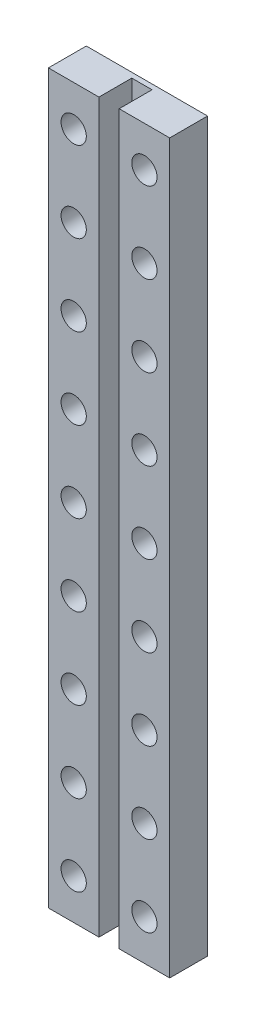
ISO-10303-21;
HEADER;
FILE_DESCRIPTION(('STEP AP214'),'2;1');
FILE_NAME('part.step','',(''),(''),'','','');
FILE_SCHEMA(('AUTOMOTIVE_DESIGN { 1 0 10303 214 1 1 1 1 }'));
ENDSEC;
DATA;
#1=APPLICATION_CONTEXT('core data for automotive mechanical design processes');
#2=APPLICATION_PROTOCOL_DEFINITION('international standard','automotive_design',2000,#1);
#3=PRODUCT_CONTEXT('',#1,'mechanical');
#4=PRODUCT('Part','Part','',(#3));
#5=PRODUCT_RELATED_PRODUCT_CATEGORY('part','',(#4));
#6=PRODUCT_DEFINITION_FORMATION('','',#4);
#7=PRODUCT_DEFINITION_CONTEXT('part definition',#1,'design');
#8=PRODUCT_DEFINITION('design','',#6,#7);
#9=PRODUCT_DEFINITION_SHAPE('','',#8);
#10=(LENGTH_UNIT() NAMED_UNIT(*) SI_UNIT(.MILLI.,.METRE.));
#11=(NAMED_UNIT(*) PLANE_ANGLE_UNIT() SI_UNIT($,.RADIAN.));
#12=(NAMED_UNIT(*) SI_UNIT($,.STERADIAN.) SOLID_ANGLE_UNIT());
#13=UNCERTAINTY_MEASURE_WITH_UNIT(LENGTH_MEASURE(1.E-05),#10,'distance_accuracy_value','');
#14=(GEOMETRIC_REPRESENTATION_CONTEXT(3) GLOBAL_UNCERTAINTY_ASSIGNED_CONTEXT((#13)) GLOBAL_UNIT_ASSIGNED_CONTEXT((#10,
#11,#12)) REPRESENTATION_CONTEXT('',''));
#15=CARTESIAN_POINT('',(0.,0.,0.));
#16=DIRECTION('',(0.,0.,1.));
#17=DIRECTION('',(1.,0.,0.));
#18=AXIS2_PLACEMENT_3D('',#15,#16,#17);
#19=CARTESIAN_POINT('',(-2.,-144.,3.75));
#20=DIRECTION('',(0.,0.,1.));
#21=DIRECTION('',(1.,0.,0.));
#22=AXIS2_PLACEMENT_3D('',#19,#20,#21);
#23=PLANE('',#22);
#24=CARTESIAN_POINT('',(-6.99999999999866,-136.,3.75));
#25=DIRECTION('',(0.,0.,1.));
#26=DIRECTION('',(1.,0.,0.));
#27=AXIS2_PLACEMENT_3D('',#24,#25,#26);
#28=CIRCLE('',#27,2.5);
#29=CARTESIAN_POINT('',(-4.49999999999866,-136.,3.75));
#30=VERTEX_POINT('',#29);
#31=EDGE_CURVE('E276',#30,#30,#28,.T.);
#32=ORIENTED_EDGE('',*,*,#31,.F.);
#33=EDGE_LOOP('',(#32));
#34=FACE_BOUND('',#33,.T.);
#35=CARTESIAN_POINT('',(-6.99999999999882,-120.,3.75));
#36=DIRECTION('',(0.,0.,1.));
#37=DIRECTION('',(1.,0.,0.));
#38=AXIS2_PLACEMENT_3D('',#35,#36,#37);
#39=CIRCLE('',#38,2.5);
#40=CARTESIAN_POINT('',(-4.49999999999883,-120.,3.75));
#41=VERTEX_POINT('',#40);
#42=EDGE_CURVE('E278',#41,#41,#39,.T.);
#43=ORIENTED_EDGE('',*,*,#42,.F.);
#44=EDGE_LOOP('',(#43));
#45=FACE_BOUND('',#44,.T.);
#46=CARTESIAN_POINT('',(-6.99999999999899,-104.,3.75));
#47=DIRECTION('',(0.,0.,1.));
#48=DIRECTION('',(1.,0.,0.));
#49=AXIS2_PLACEMENT_3D('',#46,#47,#48);
#50=CIRCLE('',#49,2.5);
#51=CARTESIAN_POINT('',(-4.49999999999899,-104.,3.75));
#52=VERTEX_POINT('',#51);
#53=EDGE_CURVE('E284',#52,#52,#50,.T.);
#54=ORIENTED_EDGE('',*,*,#53,.F.);
#55=EDGE_LOOP('',(#54));
#56=FACE_BOUND('',#55,.T.);
#57=CARTESIAN_POINT('',(-6.99999999999916,-88.,3.75));
#58=DIRECTION('',(0.,0.,1.));
#59=DIRECTION('',(1.,0.,0.));
#60=AXIS2_PLACEMENT_3D('',#57,#58,#59);
#61=CIRCLE('',#60,2.5);
#62=CARTESIAN_POINT('',(-4.49999999999916,-88.,3.75));
#63=VERTEX_POINT('',#62);
#64=EDGE_CURVE('E290',#63,#63,#61,.T.);
#65=ORIENTED_EDGE('',*,*,#64,.F.);
#66=EDGE_LOOP('',(#65));
#67=FACE_BOUND('',#66,.T.);
#68=CARTESIAN_POINT('',(-6.99999999999933,-72.,3.75));
#69=DIRECTION('',(0.,0.,1.));
#70=DIRECTION('',(1.,0.,0.));
#71=AXIS2_PLACEMENT_3D('',#68,#69,#70);
#72=CIRCLE('',#71,2.5);
#73=CARTESIAN_POINT('',(-4.49999999999933,-72.,3.75));
#74=VERTEX_POINT('',#73);
#75=EDGE_CURVE('E296',#74,#74,#72,.T.);
#76=ORIENTED_EDGE('',*,*,#75,.F.);
#77=EDGE_LOOP('',(#76));
#78=FACE_BOUND('',#77,.T.);
#79=CARTESIAN_POINT('',(-6.99999999999949,-56.,3.75));
#80=DIRECTION('',(0.,0.,1.));
#81=DIRECTION('',(1.,0.,0.));
#82=AXIS2_PLACEMENT_3D('',#79,#80,#81);
#83=CIRCLE('',#82,2.5);
#84=CARTESIAN_POINT('',(-4.49999999999949,-56.,3.75));
#85=VERTEX_POINT('',#84);
#86=EDGE_CURVE('E302',#85,#85,#83,.T.);
#87=ORIENTED_EDGE('',*,*,#86,.F.);
#88=EDGE_LOOP('',(#87));
#89=FACE_BOUND('',#88,.T.);
#90=CARTESIAN_POINT('',(-6.99999999999966,-40.,3.75));
#91=DIRECTION('',(0.,0.,1.));
#92=DIRECTION('',(1.,0.,0.));
#93=AXIS2_PLACEMENT_3D('',#90,#91,#92);
#94=CIRCLE('',#93,2.5);
#95=CARTESIAN_POINT('',(-4.49999999999966,-40.,3.75));
#96=VERTEX_POINT('',#95);
#97=EDGE_CURVE('E308',#96,#96,#94,.T.);
#98=ORIENTED_EDGE('',*,*,#97,.F.);
#99=EDGE_LOOP('',(#98));
#100=FACE_BOUND('',#99,.T.);
#101=CARTESIAN_POINT('',(-6.99999999999983,-24.,3.75));
#102=DIRECTION('',(0.,0.,1.));
#103=DIRECTION('',(1.,0.,0.));
#104=AXIS2_PLACEMENT_3D('',#101,#102,#103);
#105=CIRCLE('',#104,2.5);
#106=CARTESIAN_POINT('',(-4.49999999999983,-24.,3.75));
#107=VERTEX_POINT('',#106);
#108=EDGE_CURVE('E314',#107,#107,#105,.T.);
#109=ORIENTED_EDGE('',*,*,#108,.F.);
#110=EDGE_LOOP('',(#109));
#111=FACE_BOUND('',#110,.T.);
#112=CARTESIAN_POINT('',(-7.,-8.,3.75));
#113=DIRECTION('',(0.,0.,1.));
#114=DIRECTION('',(1.,0.,0.));
#115=AXIS2_PLACEMENT_3D('',#112,#113,#114);
#116=CIRCLE('',#115,2.5);
#117=CARTESIAN_POINT('',(-4.5,-8.,3.75));
#118=VERTEX_POINT('',#117);
#119=EDGE_CURVE('E374',#118,#118,#116,.T.);
#120=ORIENTED_EDGE('',*,*,#119,.F.);
#121=EDGE_LOOP('',(#120));
#122=FACE_BOUND('',#121,.T.);
#123=DIRECTION('',(1.,0.,0.));
#124=VECTOR('',#123,1.);
#125=CARTESIAN_POINT('',(-2.,0.,3.75));
#126=LINE('',#125,#124);
#127=CARTESIAN_POINT('',(-12.,0.,3.75));
#128=VERTEX_POINT('',#127);
#129=CARTESIAN_POINT('',(-2.,0.,3.75));
#130=VERTEX_POINT('',#129);
#131=EDGE_CURVE('E130',#128,#130,#126,.T.);
#132=ORIENTED_EDGE('',*,*,#131,.F.);
#133=DIRECTION('',(0.,1.,0.));
#134=VECTOR('',#133,1.);
#135=CARTESIAN_POINT('',(-12.,-144.,3.75));
#136=LINE('',#135,#134);
#137=CARTESIAN_POINT('',(-12.,-144.,3.75));
#138=VERTEX_POINT('',#137);
#139=EDGE_CURVE('E11',#138,#128,#136,.T.);
#140=ORIENTED_EDGE('',*,*,#139,.F.);
#141=DIRECTION('',(1.,0.,0.));
#142=VECTOR('',#141,1.);
#143=CARTESIAN_POINT('',(-2.,-144.,3.75));
#144=LINE('',#143,#142);
#145=CARTESIAN_POINT('',(-2.,-144.,3.75));
#146=VERTEX_POINT('',#145);
#147=EDGE_CURVE('E151',#138,#146,#144,.T.);
#148=ORIENTED_EDGE('',*,*,#147,.T.);
#149=DIRECTION('',(0.,1.,0.));
#150=VECTOR('',#149,1.);
#151=CARTESIAN_POINT('',(-2.,-144.,3.75));
#152=LINE('',#151,#150);
#153=EDGE_CURVE('E36',#146,#130,#152,.T.);
#154=ORIENTED_EDGE('',*,*,#153,.T.);
#155=EDGE_LOOP('',(#132,#140,#148,#154));
#156=FACE_BOUND('',#155,.T.);
#157=ADVANCED_FACE('F33',(#34,#45,#56,#67,#78,#89,#100,#111,#122,#156),#23,.T.);
#158=CARTESIAN_POINT('',(-12.,-144.,-3.75));
#159=DIRECTION('',(-1.,0.,0.));
#160=DIRECTION('',(0.,0.,1.));
#161=AXIS2_PLACEMENT_3D('',#158,#159,#160);
#162=PLANE('',#161);
#163=DIRECTION('',(0.,0.,1.));
#164=VECTOR('',#163,1.);
#165=CARTESIAN_POINT('',(-12.,0.,-3.75));
#166=LINE('',#165,#164);
#167=CARTESIAN_POINT('',(-12.,0.,-3.75));
#168=VERTEX_POINT('',#167);
#169=EDGE_CURVE('E149',#168,#128,#166,.T.);
#170=ORIENTED_EDGE('',*,*,#169,.F.);
#171=DIRECTION('',(0.,1.,0.));
#172=VECTOR('',#171,1.);
#173=CARTESIAN_POINT('',(-12.,-144.,-3.75));
#174=LINE('',#173,#172);
#175=CARTESIAN_POINT('',(-12.,-144.,-3.75));
#176=VERTEX_POINT('',#175);
#177=EDGE_CURVE('E42',#176,#168,#174,.T.);
#178=ORIENTED_EDGE('',*,*,#177,.F.);
#179=DIRECTION('',(0.,0.,1.));
#180=VECTOR('',#179,1.);
#181=CARTESIAN_POINT('',(-12.,-144.,-3.75));
#182=LINE('',#181,#180);
#183=EDGE_CURVE('E120',#176,#138,#182,.T.);
#184=ORIENTED_EDGE('',*,*,#183,.T.);
#185=ORIENTED_EDGE('',*,*,#139,.T.);
#186=EDGE_LOOP('',(#170,#178,#184,#185));
#187=FACE_BOUND('',#186,.T.);
#188=ADVANCED_FACE('F163',(#187),#162,.T.);
#189=CARTESIAN_POINT('',(12.,-144.,-3.75));
#190=DIRECTION('',(0.,0.,-1.));
#191=DIRECTION('',(-1.,0.,0.));
#192=AXIS2_PLACEMENT_3D('',#189,#190,#191);
#193=PLANE('',#192);
#194=CARTESIAN_POINT('',(-6.99999999999866,-136.,-3.75));
#195=DIRECTION('',(0.,0.,1.));
#196=DIRECTION('',(1.,0.,0.));
#197=AXIS2_PLACEMENT_3D('',#194,#195,#196);
#198=CIRCLE('',#197,2.5);
#199=CARTESIAN_POINT('',(-4.49999999999866,-136.,-3.75));
#200=VERTEX_POINT('',#199);
#201=EDGE_CURVE('E273',#200,#200,#198,.T.);
#202=ORIENTED_EDGE('',*,*,#201,.T.);
#203=EDGE_LOOP('',(#202));
#204=FACE_BOUND('',#203,.T.);
#205=CARTESIAN_POINT('',(-6.99999999999882,-120.,-3.75));
#206=DIRECTION('',(0.,0.,1.));
#207=DIRECTION('',(1.,0.,0.));
#208=AXIS2_PLACEMENT_3D('',#205,#206,#207);
#209=CIRCLE('',#208,2.5);
#210=CARTESIAN_POINT('',(-4.49999999999883,-120.,-3.75));
#211=VERTEX_POINT('',#210);
#212=EDGE_CURVE('E281',#211,#211,#209,.T.);
#213=ORIENTED_EDGE('',*,*,#212,.T.);
#214=EDGE_LOOP('',(#213));
#215=FACE_BOUND('',#214,.T.);
#216=CARTESIAN_POINT('',(-6.99999999999899,-104.,-3.75));
#217=DIRECTION('',(0.,0.,1.));
#218=DIRECTION('',(1.,0.,0.));
#219=AXIS2_PLACEMENT_3D('',#216,#217,#218);
#220=CIRCLE('',#219,2.5);
#221=CARTESIAN_POINT('',(-4.49999999999899,-104.,-3.75));
#222=VERTEX_POINT('',#221);
#223=EDGE_CURVE('E287',#222,#222,#220,.T.);
#224=ORIENTED_EDGE('',*,*,#223,.T.);
#225=EDGE_LOOP('',(#224));
#226=FACE_BOUND('',#225,.T.);
#227=CARTESIAN_POINT('',(-6.99999999999916,-88.,-3.75));
#228=DIRECTION('',(0.,0.,1.));
#229=DIRECTION('',(1.,0.,0.));
#230=AXIS2_PLACEMENT_3D('',#227,#228,#229);
#231=CIRCLE('',#230,2.5);
#232=CARTESIAN_POINT('',(-4.49999999999916,-88.,-3.75));
#233=VERTEX_POINT('',#232);
#234=EDGE_CURVE('E293',#233,#233,#231,.T.);
#235=ORIENTED_EDGE('',*,*,#234,.T.);
#236=EDGE_LOOP('',(#235));
#237=FACE_BOUND('',#236,.T.);
#238=CARTESIAN_POINT('',(-6.99999999999933,-72.,-3.75));
#239=DIRECTION('',(0.,0.,1.));
#240=DIRECTION('',(1.,0.,0.));
#241=AXIS2_PLACEMENT_3D('',#238,#239,#240);
#242=CIRCLE('',#241,2.5);
#243=CARTESIAN_POINT('',(-4.49999999999933,-72.,-3.75));
#244=VERTEX_POINT('',#243);
#245=EDGE_CURVE('E299',#244,#244,#242,.T.);
#246=ORIENTED_EDGE('',*,*,#245,.T.);
#247=EDGE_LOOP('',(#246));
#248=FACE_BOUND('',#247,.T.);
#249=CARTESIAN_POINT('',(-6.99999999999949,-56.,-3.75));
#250=DIRECTION('',(0.,0.,1.));
#251=DIRECTION('',(1.,0.,0.));
#252=AXIS2_PLACEMENT_3D('',#249,#250,#251);
#253=CIRCLE('',#252,2.5);
#254=CARTESIAN_POINT('',(-4.49999999999949,-56.,-3.75));
#255=VERTEX_POINT('',#254);
#256=EDGE_CURVE('E305',#255,#255,#253,.T.);
#257=ORIENTED_EDGE('',*,*,#256,.T.);
#258=EDGE_LOOP('',(#257));
#259=FACE_BOUND('',#258,.T.);
#260=CARTESIAN_POINT('',(-6.99999999999966,-40.,-3.75));
#261=DIRECTION('',(0.,0.,1.));
#262=DIRECTION('',(1.,0.,0.));
#263=AXIS2_PLACEMENT_3D('',#260,#261,#262);
#264=CIRCLE('',#263,2.5);
#265=CARTESIAN_POINT('',(-4.49999999999966,-40.,-3.75));
#266=VERTEX_POINT('',#265);
#267=EDGE_CURVE('E311',#266,#266,#264,.T.);
#268=ORIENTED_EDGE('',*,*,#267,.T.);
#269=EDGE_LOOP('',(#268));
#270=FACE_BOUND('',#269,.T.);
#271=CARTESIAN_POINT('',(-6.99999999999983,-24.,-3.75));
#272=DIRECTION('',(0.,0.,1.));
#273=DIRECTION('',(1.,0.,0.));
#274=AXIS2_PLACEMENT_3D('',#271,#272,#273);
#275=CIRCLE('',#274,2.5);
#276=CARTESIAN_POINT('',(-4.49999999999983,-24.,-3.75));
#277=VERTEX_POINT('',#276);
#278=EDGE_CURVE('E317',#277,#277,#275,.T.);
#279=ORIENTED_EDGE('',*,*,#278,.T.);
#280=EDGE_LOOP('',(#279));
#281=FACE_BOUND('',#280,.T.);
#282=CARTESIAN_POINT('',(7.00000000000134,-136.,-3.75));
#283=DIRECTION('',(0.,0.,1.));
#284=DIRECTION('',(1.,0.,0.));
#285=AXIS2_PLACEMENT_3D('',#282,#283,#284);
#286=CIRCLE('',#285,2.5);
#287=CARTESIAN_POINT('',(9.50000000000134,-136.,-3.75));
#288=VERTEX_POINT('',#287);
#289=EDGE_CURVE('E323',#288,#288,#286,.T.);
#290=ORIENTED_EDGE('',*,*,#289,.T.);
#291=EDGE_LOOP('',(#290));
#292=FACE_BOUND('',#291,.T.);
#293=CARTESIAN_POINT('',(7.00000000000118,-120.,-3.75));
#294=DIRECTION('',(0.,0.,1.));
#295=DIRECTION('',(1.,0.,0.));
#296=AXIS2_PLACEMENT_3D('',#293,#294,#295);
#297=CIRCLE('',#296,2.5);
#298=CARTESIAN_POINT('',(9.50000000000117,-120.,-3.75));
#299=VERTEX_POINT('',#298);
#300=EDGE_CURVE('E329',#299,#299,#297,.T.);
#301=ORIENTED_EDGE('',*,*,#300,.T.);
#302=EDGE_LOOP('',(#301));
#303=FACE_BOUND('',#302,.T.);
#304=CARTESIAN_POINT('',(7.00000000000101,-104.,-3.75));
#305=DIRECTION('',(0.,0.,1.));
#306=DIRECTION('',(1.,0.,0.));
#307=AXIS2_PLACEMENT_3D('',#304,#305,#306);
#308=CIRCLE('',#307,2.5);
#309=CARTESIAN_POINT('',(9.50000000000101,-104.,-3.75));
#310=VERTEX_POINT('',#309);
#311=EDGE_CURVE('E335',#310,#310,#308,.T.);
#312=ORIENTED_EDGE('',*,*,#311,.T.);
#313=EDGE_LOOP('',(#312));
#314=FACE_BOUND('',#313,.T.);
#315=CARTESIAN_POINT('',(7.00000000000084,-88.,-3.75));
#316=DIRECTION('',(0.,0.,1.));
#317=DIRECTION('',(1.,0.,0.));
#318=AXIS2_PLACEMENT_3D('',#315,#316,#317);
#319=CIRCLE('',#318,2.5);
#320=CARTESIAN_POINT('',(9.50000000000084,-88.,-3.75));
#321=VERTEX_POINT('',#320);
#322=EDGE_CURVE('E341',#321,#321,#319,.T.);
#323=ORIENTED_EDGE('',*,*,#322,.T.);
#324=EDGE_LOOP('',(#323));
#325=FACE_BOUND('',#324,.T.);
#326=CARTESIAN_POINT('',(7.00000000000067,-72.,-3.75));
#327=DIRECTION('',(0.,0.,1.));
#328=DIRECTION('',(1.,0.,0.));
#329=AXIS2_PLACEMENT_3D('',#326,#327,#328);
#330=CIRCLE('',#329,2.5);
#331=CARTESIAN_POINT('',(9.50000000000067,-72.,-3.75));
#332=VERTEX_POINT('',#331);
#333=EDGE_CURVE('E347',#332,#332,#330,.T.);
#334=ORIENTED_EDGE('',*,*,#333,.T.);
#335=EDGE_LOOP('',(#334));
#336=FACE_BOUND('',#335,.T.);
#337=CARTESIAN_POINT('',(7.00000000000051,-56.,-3.75));
#338=DIRECTION('',(0.,0.,1.));
#339=DIRECTION('',(1.,0.,0.));
#340=AXIS2_PLACEMENT_3D('',#337,#338,#339);
#341=CIRCLE('',#340,2.5);
#342=CARTESIAN_POINT('',(9.5000000000005,-56.,-3.75));
#343=VERTEX_POINT('',#342);
#344=EDGE_CURVE('E353',#343,#343,#341,.T.);
#345=ORIENTED_EDGE('',*,*,#344,.T.);
#346=EDGE_LOOP('',(#345));
#347=FACE_BOUND('',#346,.T.);
#348=CARTESIAN_POINT('',(7.00000000000034,-40.,-3.75));
#349=DIRECTION('',(0.,0.,1.));
#350=DIRECTION('',(1.,0.,0.));
#351=AXIS2_PLACEMENT_3D('',#348,#349,#350);
#352=CIRCLE('',#351,2.5);
#353=CARTESIAN_POINT('',(9.50000000000034,-40.,-3.75));
#354=VERTEX_POINT('',#353);
#355=EDGE_CURVE('E359',#354,#354,#352,.T.);
#356=ORIENTED_EDGE('',*,*,#355,.T.);
#357=EDGE_LOOP('',(#356));
#358=FACE_BOUND('',#357,.T.);
#359=CARTESIAN_POINT('',(7.00000000000017,-24.,-3.75));
#360=DIRECTION('',(0.,0.,1.));
#361=DIRECTION('',(1.,0.,0.));
#362=AXIS2_PLACEMENT_3D('',#359,#360,#361);
#363=CIRCLE('',#362,2.5);
#364=CARTESIAN_POINT('',(9.50000000000017,-24.,-3.75));
#365=VERTEX_POINT('',#364);
#366=EDGE_CURVE('E365',#365,#365,#363,.T.);
#367=ORIENTED_EDGE('',*,*,#366,.T.);
#368=EDGE_LOOP('',(#367));
#369=FACE_BOUND('',#368,.T.);
#370=CARTESIAN_POINT('',(7.,-8.,-3.75));
#371=DIRECTION('',(0.,0.,1.));
#372=DIRECTION('',(1.,0.,0.));
#373=AXIS2_PLACEMENT_3D('',#370,#371,#372);
#374=CIRCLE('',#373,2.5);
#375=CARTESIAN_POINT('',(9.5,-8.,-3.75));
#376=VERTEX_POINT('',#375);
#377=EDGE_CURVE('E371',#376,#376,#374,.T.);
#378=ORIENTED_EDGE('',*,*,#377,.T.);
#379=EDGE_LOOP('',(#378));
#380=FACE_BOUND('',#379,.T.);
#381=CARTESIAN_POINT('',(-7.,-8.,-3.75));
#382=DIRECTION('',(0.,0.,1.));
#383=DIRECTION('',(1.,0.,0.));
#384=AXIS2_PLACEMENT_3D('',#381,#382,#383);
#385=CIRCLE('',#384,2.5);
#386=CARTESIAN_POINT('',(-4.5,-8.,-3.75));
#387=VERTEX_POINT('',#386);
#388=EDGE_CURVE('E134',#387,#387,#385,.T.);
#389=ORIENTED_EDGE('',*,*,#388,.T.);
#390=EDGE_LOOP('',(#389));
#391=FACE_BOUND('',#390,.T.);
#392=DIRECTION('',(-1.,0.,0.));
#393=VECTOR('',#392,1.);
#394=CARTESIAN_POINT('',(12.,0.,-3.75));
#395=LINE('',#394,#393);
#396=CARTESIAN_POINT('',(12.,0.,-3.75));
#397=VERTEX_POINT('',#396);
#398=EDGE_CURVE('E107',#397,#168,#395,.T.);
#399=ORIENTED_EDGE('',*,*,#398,.F.);
#400=DIRECTION('',(0.,1.,0.));
#401=VECTOR('',#400,1.);
#402=CARTESIAN_POINT('',(12.,-144.,-3.75));
#403=LINE('',#402,#401);
#404=CARTESIAN_POINT('',(12.,-144.,-3.75));
#405=VERTEX_POINT('',#404);
#406=EDGE_CURVE('E102',#405,#397,#403,.T.);
#407=ORIENTED_EDGE('',*,*,#406,.F.);
#408=DIRECTION('',(-1.,0.,0.));
#409=VECTOR('',#408,1.);
#410=CARTESIAN_POINT('',(12.,-144.,-3.75));
#411=LINE('',#410,#409);
#412=EDGE_CURVE('E105',#405,#176,#411,.T.);
#413=ORIENTED_EDGE('',*,*,#412,.T.);
#414=ORIENTED_EDGE('',*,*,#177,.T.);
#415=EDGE_LOOP('',(#399,#407,#413,#414));
#416=FACE_BOUND('',#415,.T.);
#417=ADVANCED_FACE('F104',(#204,#215,#226,#237,#248,#259,#270,#281,#292,#303,#314,#325,#336,
#347,#358,#369,#380,#391,#416),#193,.T.);
#418=CARTESIAN_POINT('',(12.,-144.,-3.75));
#419=DIRECTION('',(1.,0.,0.));
#420=DIRECTION('',(0.,0.,-1.));
#421=AXIS2_PLACEMENT_3D('',#418,#419,#420);
#422=PLANE('',#421);
#423=DIRECTION('',(0.,0.,-1.));
#424=VECTOR('',#423,1.);
#425=CARTESIAN_POINT('',(12.,0.,-3.75));
#426=LINE('',#425,#424);
#427=CARTESIAN_POINT('',(12.,0.,3.75));
#428=VERTEX_POINT('',#427);
#429=EDGE_CURVE('E146',#428,#397,#426,.T.);
#430=ORIENTED_EDGE('',*,*,#429,.F.);
#431=DIRECTION('',(0.,1.,0.));
#432=VECTOR('',#431,1.);
#433=CARTESIAN_POINT('',(12.,-144.,3.75));
#434=LINE('',#433,#432);
#435=CARTESIAN_POINT('',(12.,-144.,3.75));
#436=VERTEX_POINT('',#435);
#437=EDGE_CURVE('E112',#436,#428,#434,.T.);
#438=ORIENTED_EDGE('',*,*,#437,.F.);
#439=DIRECTION('',(0.,0.,-1.));
#440=VECTOR('',#439,1.);
#441=CARTESIAN_POINT('',(12.,-144.,-3.75));
#442=LINE('',#441,#440);
#443=EDGE_CURVE('E118',#436,#405,#442,.T.);
#444=ORIENTED_EDGE('',*,*,#443,.T.);
#445=ORIENTED_EDGE('',*,*,#406,.T.);
#446=EDGE_LOOP('',(#430,#438,#444,#445));
#447=FACE_BOUND('',#446,.T.);
#448=ADVANCED_FACE('F122',(#447),#422,.T.);
#449=CARTESIAN_POINT('',(12.,-144.,3.75));
#450=DIRECTION('',(0.,0.,1.));
#451=DIRECTION('',(1.,0.,0.));
#452=AXIS2_PLACEMENT_3D('',#449,#450,#451);
#453=PLANE('',#452);
#454=CARTESIAN_POINT('',(7.00000000000134,-136.,3.75));
#455=DIRECTION('',(0.,0.,1.));
#456=DIRECTION('',(1.,0.,0.));
#457=AXIS2_PLACEMENT_3D('',#454,#455,#456);
#458=CIRCLE('',#457,2.5);
#459=CARTESIAN_POINT('',(9.50000000000134,-136.,3.75));
#460=VERTEX_POINT('',#459);
#461=EDGE_CURVE('E320',#460,#460,#458,.T.);
#462=ORIENTED_EDGE('',*,*,#461,.F.);
#463=EDGE_LOOP('',(#462));
#464=FACE_BOUND('',#463,.T.);
#465=CARTESIAN_POINT('',(7.00000000000118,-120.,3.75));
#466=DIRECTION('',(0.,0.,1.));
#467=DIRECTION('',(1.,0.,0.));
#468=AXIS2_PLACEMENT_3D('',#465,#466,#467);
#469=CIRCLE('',#468,2.5);
#470=CARTESIAN_POINT('',(9.50000000000117,-120.,3.75));
#471=VERTEX_POINT('',#470);
#472=EDGE_CURVE('E326',#471,#471,#469,.T.);
#473=ORIENTED_EDGE('',*,*,#472,.F.);
#474=EDGE_LOOP('',(#473));
#475=FACE_BOUND('',#474,.T.);
#476=CARTESIAN_POINT('',(7.00000000000101,-104.,3.75));
#477=DIRECTION('',(0.,0.,1.));
#478=DIRECTION('',(1.,0.,0.));
#479=AXIS2_PLACEMENT_3D('',#476,#477,#478);
#480=CIRCLE('',#479,2.5);
#481=CARTESIAN_POINT('',(9.50000000000101,-104.,3.75));
#482=VERTEX_POINT('',#481);
#483=EDGE_CURVE('E332',#482,#482,#480,.T.);
#484=ORIENTED_EDGE('',*,*,#483,.F.);
#485=EDGE_LOOP('',(#484));
#486=FACE_BOUND('',#485,.T.);
#487=CARTESIAN_POINT('',(7.00000000000084,-88.,3.75));
#488=DIRECTION('',(0.,0.,1.));
#489=DIRECTION('',(1.,0.,0.));
#490=AXIS2_PLACEMENT_3D('',#487,#488,#489);
#491=CIRCLE('',#490,2.5);
#492=CARTESIAN_POINT('',(9.50000000000084,-88.,3.75));
#493=VERTEX_POINT('',#492);
#494=EDGE_CURVE('E338',#493,#493,#491,.T.);
#495=ORIENTED_EDGE('',*,*,#494,.F.);
#496=EDGE_LOOP('',(#495));
#497=FACE_BOUND('',#496,.T.);
#498=CARTESIAN_POINT('',(7.00000000000067,-72.,3.75));
#499=DIRECTION('',(0.,0.,1.));
#500=DIRECTION('',(1.,0.,0.));
#501=AXIS2_PLACEMENT_3D('',#498,#499,#500);
#502=CIRCLE('',#501,2.5);
#503=CARTESIAN_POINT('',(9.50000000000067,-72.,3.75));
#504=VERTEX_POINT('',#503);
#505=EDGE_CURVE('E344',#504,#504,#502,.T.);
#506=ORIENTED_EDGE('',*,*,#505,.F.);
#507=EDGE_LOOP('',(#506));
#508=FACE_BOUND('',#507,.T.);
#509=CARTESIAN_POINT('',(7.00000000000051,-56.,3.75));
#510=DIRECTION('',(0.,0.,1.));
#511=DIRECTION('',(1.,0.,0.));
#512=AXIS2_PLACEMENT_3D('',#509,#510,#511);
#513=CIRCLE('',#512,2.5);
#514=CARTESIAN_POINT('',(9.5000000000005,-56.,3.75));
#515=VERTEX_POINT('',#514);
#516=EDGE_CURVE('E350',#515,#515,#513,.T.);
#517=ORIENTED_EDGE('',*,*,#516,.F.);
#518=EDGE_LOOP('',(#517));
#519=FACE_BOUND('',#518,.T.);
#520=CARTESIAN_POINT('',(7.00000000000034,-40.,3.75));
#521=DIRECTION('',(0.,0.,1.));
#522=DIRECTION('',(1.,0.,0.));
#523=AXIS2_PLACEMENT_3D('',#520,#521,#522);
#524=CIRCLE('',#523,2.5);
#525=CARTESIAN_POINT('',(9.50000000000034,-40.,3.75));
#526=VERTEX_POINT('',#525);
#527=EDGE_CURVE('E356',#526,#526,#524,.T.);
#528=ORIENTED_EDGE('',*,*,#527,.F.);
#529=EDGE_LOOP('',(#528));
#530=FACE_BOUND('',#529,.T.);
#531=CARTESIAN_POINT('',(7.00000000000017,-24.,3.75));
#532=DIRECTION('',(0.,0.,1.));
#533=DIRECTION('',(1.,0.,0.));
#534=AXIS2_PLACEMENT_3D('',#531,#532,#533);
#535=CIRCLE('',#534,2.5);
#536=CARTESIAN_POINT('',(9.50000000000017,-24.,3.75));
#537=VERTEX_POINT('',#536);
#538=EDGE_CURVE('E362',#537,#537,#535,.T.);
#539=ORIENTED_EDGE('',*,*,#538,.F.);
#540=EDGE_LOOP('',(#539));
#541=FACE_BOUND('',#540,.T.);
#542=CARTESIAN_POINT('',(7.,-8.,3.75));
#543=DIRECTION('',(0.,0.,1.));
#544=DIRECTION('',(1.,0.,0.));
#545=AXIS2_PLACEMENT_3D('',#542,#543,#544);
#546=CIRCLE('',#545,2.5);
#547=CARTESIAN_POINT('',(9.5,-8.,3.75));
#548=VERTEX_POINT('',#547);
#549=EDGE_CURVE('E368',#548,#548,#546,.T.);
#550=ORIENTED_EDGE('',*,*,#549,.F.);
#551=EDGE_LOOP('',(#550));
#552=FACE_BOUND('',#551,.T.);
#553=DIRECTION('',(1.,0.,0.));
#554=VECTOR('',#553,1.);
#555=CARTESIAN_POINT('',(12.,0.,3.75));
#556=LINE('',#555,#554);
#557=CARTESIAN_POINT('',(2.,0.,3.75));
#558=VERTEX_POINT('',#557);
#559=EDGE_CURVE('E143',#558,#428,#556,.T.);
#560=ORIENTED_EDGE('',*,*,#559,.F.);
#561=DIRECTION('',(0.,1.,0.));
#562=VECTOR('',#561,1.);
#563=CARTESIAN_POINT('',(2.,-144.,3.75));
#564=LINE('',#563,#562);
#565=CARTESIAN_POINT('',(2.,-144.,3.75));
#566=VERTEX_POINT('',#565);
#567=EDGE_CURVE('E155',#566,#558,#564,.T.);
#568=ORIENTED_EDGE('',*,*,#567,.F.);
#569=DIRECTION('',(1.,0.,0.));
#570=VECTOR('',#569,1.);
#571=CARTESIAN_POINT('',(12.,-144.,3.75));
#572=LINE('',#571,#570);
#573=EDGE_CURVE('E123',#566,#436,#572,.T.);
#574=ORIENTED_EDGE('',*,*,#573,.T.);
#575=ORIENTED_EDGE('',*,*,#437,.T.);
#576=EDGE_LOOP('',(#560,#568,#574,#575));
#577=FACE_BOUND('',#576,.T.);
#578=ADVANCED_FACE('F178',(#464,#475,#486,#497,#508,#519,#530,#541,#552,#577),#453,.T.);
#579=CARTESIAN_POINT('',(2.,-144.,-2.75));
#580=DIRECTION('',(-1.,0.,0.));
#581=DIRECTION('',(0.,0.,1.));
#582=AXIS2_PLACEMENT_3D('',#579,#580,#581);
#583=PLANE('',#582);
#584=DIRECTION('',(0.,0.,1.));
#585=VECTOR('',#584,1.);
#586=CARTESIAN_POINT('',(2.,0.,-2.75));
#587=LINE('',#586,#585);
#588=CARTESIAN_POINT('',(2.,0.,-2.75));
#589=VERTEX_POINT('',#588);
#590=EDGE_CURVE('E140',#589,#558,#587,.T.);
#591=ORIENTED_EDGE('',*,*,#590,.F.);
#592=DIRECTION('',(0.,1.,0.));
#593=VECTOR('',#592,1.);
#594=CARTESIAN_POINT('',(2.,-144.,-2.75));
#595=LINE('',#594,#593);
#596=CARTESIAN_POINT('',(2.,-144.,-2.75));
#597=VERTEX_POINT('',#596);
#598=EDGE_CURVE('E157',#597,#589,#595,.T.);
#599=ORIENTED_EDGE('',*,*,#598,.F.);
#600=DIRECTION('',(0.,0.,1.));
#601=VECTOR('',#600,1.);
#602=CARTESIAN_POINT('',(2.,-144.,-2.75));
#603=LINE('',#602,#601);
#604=EDGE_CURVE('E125',#597,#566,#603,.T.);
#605=ORIENTED_EDGE('',*,*,#604,.T.);
#606=ORIENTED_EDGE('',*,*,#567,.T.);
#607=EDGE_LOOP('',(#591,#599,#605,#606));
#608=FACE_BOUND('',#607,.T.);
#609=ADVANCED_FACE('F181',(#608),#583,.T.);
#610=CARTESIAN_POINT('',(-2.,-144.,-2.75));
#611=DIRECTION('',(0.,0.,1.));
#612=DIRECTION('',(1.,0.,0.));
#613=AXIS2_PLACEMENT_3D('',#610,#611,#612);
#614=PLANE('',#613);
#615=DIRECTION('',(1.,0.,0.));
#616=VECTOR('',#615,1.);
#617=CARTESIAN_POINT('',(-2.,0.,-2.75));
#618=LINE('',#617,#616);
#619=CARTESIAN_POINT('',(-2.,0.,-2.75));
#620=VERTEX_POINT('',#619);
#621=EDGE_CURVE('E137',#620,#589,#618,.T.);
#622=ORIENTED_EDGE('',*,*,#621,.F.);
#623=DIRECTION('',(0.,1.,0.));
#624=VECTOR('',#623,1.);
#625=CARTESIAN_POINT('',(-2.,-144.,-2.75));
#626=LINE('',#625,#624);
#627=CARTESIAN_POINT('',(-2.,-144.,-2.75));
#628=VERTEX_POINT('',#627);
#629=EDGE_CURVE('E158',#628,#620,#626,.T.);
#630=ORIENTED_EDGE('',*,*,#629,.F.);
#631=DIRECTION('',(1.,0.,0.));
#632=VECTOR('',#631,1.);
#633=CARTESIAN_POINT('',(-2.,-144.,-2.75));
#634=LINE('',#633,#632);
#635=EDGE_CURVE('E384',#628,#597,#634,.T.);
#636=ORIENTED_EDGE('',*,*,#635,.T.);
#637=ORIENTED_EDGE('',*,*,#598,.T.);
#638=EDGE_LOOP('',(#622,#630,#636,#637));
#639=FACE_BOUND('',#638,.T.);
#640=ADVANCED_FACE('F185',(#639),#614,.T.);
#641=CARTESIAN_POINT('',(-2.,-144.,3.75));
#642=DIRECTION('',(1.,0.,0.));
#643=DIRECTION('',(0.,0.,-1.));
#644=AXIS2_PLACEMENT_3D('',#641,#642,#643);
#645=PLANE('',#644);
#646=DIRECTION('',(0.,0.,-1.));
#647=VECTOR('',#646,1.);
#648=CARTESIAN_POINT('',(-2.,0.,3.75));
#649=LINE('',#648,#647);
#650=EDGE_CURVE('E133',#130,#620,#649,.T.);
#651=ORIENTED_EDGE('',*,*,#650,.F.);
#652=ORIENTED_EDGE('',*,*,#153,.F.);
#653=DIRECTION('',(0.,0.,-1.));
#654=VECTOR('',#653,1.);
#655=CARTESIAN_POINT('',(-2.,-144.,3.75));
#656=LINE('',#655,#654);
#657=EDGE_CURVE('E382',#146,#628,#656,.T.);
#658=ORIENTED_EDGE('',*,*,#657,.T.);
#659=ORIENTED_EDGE('',*,*,#629,.T.);
#660=EDGE_LOOP('',(#651,#652,#658,#659));
#661=FACE_BOUND('',#660,.T.);
#662=ADVANCED_FACE('F160',(#661),#645,.T.);
#663=CARTESIAN_POINT('',(0.,-144.,0.));
#664=DIRECTION('',(0.,1.,0.));
#665=DIRECTION('',(0.,0.,1.));
#666=AXIS2_PLACEMENT_3D('',#663,#664,#665);
#667=PLANE('',#666);
#668=ORIENTED_EDGE('',*,*,#147,.F.);
#669=ORIENTED_EDGE('',*,*,#183,.F.);
#670=ORIENTED_EDGE('',*,*,#412,.F.);
#671=ORIENTED_EDGE('',*,*,#443,.F.);
#672=ORIENTED_EDGE('',*,*,#573,.F.);
#673=ORIENTED_EDGE('',*,*,#604,.F.);
#674=ORIENTED_EDGE('',*,*,#635,.F.);
#675=ORIENTED_EDGE('',*,*,#657,.F.);
#676=EDGE_LOOP('',(#668,#669,#670,#671,#672,#673,#674,#675));
#677=FACE_BOUND('',#676,.T.);
#678=ADVANCED_FACE('F116',(#677),#667,.F.);
#679=CARTESIAN_POINT('',(0.,0.,0.));
#680=DIRECTION('',(0.,1.,0.));
#681=DIRECTION('',(0.,0.,1.));
#682=AXIS2_PLACEMENT_3D('',#679,#680,#681);
#683=PLANE('',#682);
#684=ORIENTED_EDGE('',*,*,#131,.T.);
#685=ORIENTED_EDGE('',*,*,#650,.T.);
#686=ORIENTED_EDGE('',*,*,#621,.T.);
#687=ORIENTED_EDGE('',*,*,#590,.T.);
#688=ORIENTED_EDGE('',*,*,#559,.T.);
#689=ORIENTED_EDGE('',*,*,#429,.T.);
#690=ORIENTED_EDGE('',*,*,#398,.T.);
#691=ORIENTED_EDGE('',*,*,#169,.T.);
#692=EDGE_LOOP('',(#684,#685,#686,#687,#688,#689,#690,#691));
#693=FACE_BOUND('',#692,.T.);
#694=ADVANCED_FACE('F162',(#693),#683,.T.);
#695=CARTESIAN_POINT('',(-7.,-8.,-3.75));
#696=DIRECTION('',(0.,0.,1.));
#697=DIRECTION('',(1.,0.,0.));
#698=AXIS2_PLACEMENT_3D('',#695,#696,#697);
#699=CYLINDRICAL_SURFACE('',#698,2.5);
#700=ORIENTED_EDGE('',*,*,#388,.F.);
#701=EDGE_LOOP('',(#700));
#702=FACE_BOUND('',#701,.T.);
#703=ORIENTED_EDGE('',*,*,#119,.T.);
#704=EDGE_LOOP('',(#703));
#705=FACE_BOUND('',#704,.T.);
#706=ADVANCED_FACE('F196',(#702,#705),#699,.F.);
#707=CARTESIAN_POINT('',(7.,-8.,-3.75));
#708=DIRECTION('',(0.,0.,1.));
#709=DIRECTION('',(1.,0.,0.));
#710=AXIS2_PLACEMENT_3D('',#707,#708,#709);
#711=CYLINDRICAL_SURFACE('',#710,2.5);
#712=ORIENTED_EDGE('',*,*,#377,.F.);
#713=EDGE_LOOP('',(#712));
#714=FACE_BOUND('',#713,.T.);
#715=ORIENTED_EDGE('',*,*,#549,.T.);
#716=EDGE_LOOP('',(#715));
#717=FACE_BOUND('',#716,.T.);
#718=ADVANCED_FACE('F200',(#714,#717),#711,.F.);
#719=CARTESIAN_POINT('',(7.00000000000017,-24.,-3.75));
#720=DIRECTION('',(0.,0.,1.));
#721=DIRECTION('',(1.,0.,0.));
#722=AXIS2_PLACEMENT_3D('',#719,#720,#721);
#723=CYLINDRICAL_SURFACE('',#722,2.5);
#724=ORIENTED_EDGE('',*,*,#366,.F.);
#725=EDGE_LOOP('',(#724));
#726=FACE_BOUND('',#725,.T.);
#727=ORIENTED_EDGE('',*,*,#538,.T.);
#728=EDGE_LOOP('',(#727));
#729=FACE_BOUND('',#728,.T.);
#730=ADVANCED_FACE('F204',(#726,#729),#723,.F.);
#731=CARTESIAN_POINT('',(7.00000000000034,-40.,-3.75));
#732=DIRECTION('',(0.,0.,1.));
#733=DIRECTION('',(1.,0.,0.));
#734=AXIS2_PLACEMENT_3D('',#731,#732,#733);
#735=CYLINDRICAL_SURFACE('',#734,2.5);
#736=ORIENTED_EDGE('',*,*,#355,.F.);
#737=EDGE_LOOP('',(#736));
#738=FACE_BOUND('',#737,.T.);
#739=ORIENTED_EDGE('',*,*,#527,.T.);
#740=EDGE_LOOP('',(#739));
#741=FACE_BOUND('',#740,.T.);
#742=ADVANCED_FACE('F208',(#738,#741),#735,.F.);
#743=CARTESIAN_POINT('',(7.00000000000051,-56.,-3.75));
#744=DIRECTION('',(0.,0.,1.));
#745=DIRECTION('',(1.,0.,0.));
#746=AXIS2_PLACEMENT_3D('',#743,#744,#745);
#747=CYLINDRICAL_SURFACE('',#746,2.5);
#748=ORIENTED_EDGE('',*,*,#344,.F.);
#749=EDGE_LOOP('',(#748));
#750=FACE_BOUND('',#749,.T.);
#751=ORIENTED_EDGE('',*,*,#516,.T.);
#752=EDGE_LOOP('',(#751));
#753=FACE_BOUND('',#752,.T.);
#754=ADVANCED_FACE('F212',(#750,#753),#747,.F.);
#755=CARTESIAN_POINT('',(7.00000000000067,-72.,-3.75));
#756=DIRECTION('',(0.,0.,1.));
#757=DIRECTION('',(1.,0.,0.));
#758=AXIS2_PLACEMENT_3D('',#755,#756,#757);
#759=CYLINDRICAL_SURFACE('',#758,2.5);
#760=ORIENTED_EDGE('',*,*,#333,.F.);
#761=EDGE_LOOP('',(#760));
#762=FACE_BOUND('',#761,.T.);
#763=ORIENTED_EDGE('',*,*,#505,.T.);
#764=EDGE_LOOP('',(#763));
#765=FACE_BOUND('',#764,.T.);
#766=ADVANCED_FACE('F216',(#762,#765),#759,.F.);
#767=CARTESIAN_POINT('',(7.00000000000084,-88.,-3.75));
#768=DIRECTION('',(0.,0.,1.));
#769=DIRECTION('',(1.,0.,0.));
#770=AXIS2_PLACEMENT_3D('',#767,#768,#769);
#771=CYLINDRICAL_SURFACE('',#770,2.5);
#772=ORIENTED_EDGE('',*,*,#322,.F.);
#773=EDGE_LOOP('',(#772));
#774=FACE_BOUND('',#773,.T.);
#775=ORIENTED_EDGE('',*,*,#494,.T.);
#776=EDGE_LOOP('',(#775));
#777=FACE_BOUND('',#776,.T.);
#778=ADVANCED_FACE('F220',(#774,#777),#771,.F.);
#779=CARTESIAN_POINT('',(7.00000000000101,-104.,-3.75));
#780=DIRECTION('',(0.,0.,1.));
#781=DIRECTION('',(1.,0.,0.));
#782=AXIS2_PLACEMENT_3D('',#779,#780,#781);
#783=CYLINDRICAL_SURFACE('',#782,2.5);
#784=ORIENTED_EDGE('',*,*,#311,.F.);
#785=EDGE_LOOP('',(#784));
#786=FACE_BOUND('',#785,.T.);
#787=ORIENTED_EDGE('',*,*,#483,.T.);
#788=EDGE_LOOP('',(#787));
#789=FACE_BOUND('',#788,.T.);
#790=ADVANCED_FACE('F224',(#786,#789),#783,.F.);
#791=CARTESIAN_POINT('',(7.00000000000118,-120.,-3.75));
#792=DIRECTION('',(0.,0.,1.));
#793=DIRECTION('',(1.,0.,0.));
#794=AXIS2_PLACEMENT_3D('',#791,#792,#793);
#795=CYLINDRICAL_SURFACE('',#794,2.5);
#796=ORIENTED_EDGE('',*,*,#300,.F.);
#797=EDGE_LOOP('',(#796));
#798=FACE_BOUND('',#797,.T.);
#799=ORIENTED_EDGE('',*,*,#472,.T.);
#800=EDGE_LOOP('',(#799));
#801=FACE_BOUND('',#800,.T.);
#802=ADVANCED_FACE('F228',(#798,#801),#795,.F.);
#803=CARTESIAN_POINT('',(7.00000000000134,-136.,-3.75));
#804=DIRECTION('',(0.,0.,1.));
#805=DIRECTION('',(1.,0.,0.));
#806=AXIS2_PLACEMENT_3D('',#803,#804,#805);
#807=CYLINDRICAL_SURFACE('',#806,2.5);
#808=ORIENTED_EDGE('',*,*,#289,.F.);
#809=EDGE_LOOP('',(#808));
#810=FACE_BOUND('',#809,.T.);
#811=ORIENTED_EDGE('',*,*,#461,.T.);
#812=EDGE_LOOP('',(#811));
#813=FACE_BOUND('',#812,.T.);
#814=ADVANCED_FACE('F232',(#810,#813),#807,.F.);
#815=CARTESIAN_POINT('',(-6.99999999999983,-24.,-3.75));
#816=DIRECTION('',(0.,0.,1.));
#817=DIRECTION('',(1.,0.,0.));
#818=AXIS2_PLACEMENT_3D('',#815,#816,#817);
#819=CYLINDRICAL_SURFACE('',#818,2.5);
#820=ORIENTED_EDGE('',*,*,#278,.F.);
#821=EDGE_LOOP('',(#820));
#822=FACE_BOUND('',#821,.T.);
#823=ORIENTED_EDGE('',*,*,#108,.T.);
#824=EDGE_LOOP('',(#823));
#825=FACE_BOUND('',#824,.T.);
#826=ADVANCED_FACE('F236',(#822,#825),#819,.F.);
#827=CARTESIAN_POINT('',(-6.99999999999966,-40.,-3.75));
#828=DIRECTION('',(0.,0.,1.));
#829=DIRECTION('',(1.,0.,0.));
#830=AXIS2_PLACEMENT_3D('',#827,#828,#829);
#831=CYLINDRICAL_SURFACE('',#830,2.5);
#832=ORIENTED_EDGE('',*,*,#267,.F.);
#833=EDGE_LOOP('',(#832));
#834=FACE_BOUND('',#833,.T.);
#835=ORIENTED_EDGE('',*,*,#97,.T.);
#836=EDGE_LOOP('',(#835));
#837=FACE_BOUND('',#836,.T.);
#838=ADVANCED_FACE('F240',(#834,#837),#831,.F.);
#839=CARTESIAN_POINT('',(-6.99999999999949,-56.,-3.75));
#840=DIRECTION('',(0.,0.,1.));
#841=DIRECTION('',(1.,0.,0.));
#842=AXIS2_PLACEMENT_3D('',#839,#840,#841);
#843=CYLINDRICAL_SURFACE('',#842,2.5);
#844=ORIENTED_EDGE('',*,*,#256,.F.);
#845=EDGE_LOOP('',(#844));
#846=FACE_BOUND('',#845,.T.);
#847=ORIENTED_EDGE('',*,*,#86,.T.);
#848=EDGE_LOOP('',(#847));
#849=FACE_BOUND('',#848,.T.);
#850=ADVANCED_FACE('F244',(#846,#849),#843,.F.);
#851=CARTESIAN_POINT('',(-6.99999999999933,-72.,-3.75));
#852=DIRECTION('',(0.,0.,1.));
#853=DIRECTION('',(1.,0.,0.));
#854=AXIS2_PLACEMENT_3D('',#851,#852,#853);
#855=CYLINDRICAL_SURFACE('',#854,2.5);
#856=ORIENTED_EDGE('',*,*,#245,.F.);
#857=EDGE_LOOP('',(#856));
#858=FACE_BOUND('',#857,.T.);
#859=ORIENTED_EDGE('',*,*,#75,.T.);
#860=EDGE_LOOP('',(#859));
#861=FACE_BOUND('',#860,.T.);
#862=ADVANCED_FACE('F248',(#858,#861),#855,.F.);
#863=CARTESIAN_POINT('',(-6.99999999999916,-88.,-3.75));
#864=DIRECTION('',(0.,0.,1.));
#865=DIRECTION('',(1.,0.,0.));
#866=AXIS2_PLACEMENT_3D('',#863,#864,#865);
#867=CYLINDRICAL_SURFACE('',#866,2.5);
#868=ORIENTED_EDGE('',*,*,#234,.F.);
#869=EDGE_LOOP('',(#868));
#870=FACE_BOUND('',#869,.T.);
#871=ORIENTED_EDGE('',*,*,#64,.T.);
#872=EDGE_LOOP('',(#871));
#873=FACE_BOUND('',#872,.T.);
#874=ADVANCED_FACE('F252',(#870,#873),#867,.F.);
#875=CARTESIAN_POINT('',(-6.99999999999899,-104.,-3.75));
#876=DIRECTION('',(0.,0.,1.));
#877=DIRECTION('',(1.,0.,0.));
#878=AXIS2_PLACEMENT_3D('',#875,#876,#877);
#879=CYLINDRICAL_SURFACE('',#878,2.5);
#880=ORIENTED_EDGE('',*,*,#223,.F.);
#881=EDGE_LOOP('',(#880));
#882=FACE_BOUND('',#881,.T.);
#883=ORIENTED_EDGE('',*,*,#53,.T.);
#884=EDGE_LOOP('',(#883));
#885=FACE_BOUND('',#884,.T.);
#886=ADVANCED_FACE('F256',(#882,#885),#879,.F.);
#887=CARTESIAN_POINT('',(-6.99999999999882,-120.,-3.75));
#888=DIRECTION('',(0.,0.,1.));
#889=DIRECTION('',(1.,0.,0.));
#890=AXIS2_PLACEMENT_3D('',#887,#888,#889);
#891=CYLINDRICAL_SURFACE('',#890,2.5);
#892=ORIENTED_EDGE('',*,*,#212,.F.);
#893=EDGE_LOOP('',(#892));
#894=FACE_BOUND('',#893,.T.);
#895=ORIENTED_EDGE('',*,*,#42,.T.);
#896=EDGE_LOOP('',(#895));
#897=FACE_BOUND('',#896,.T.);
#898=ADVANCED_FACE('F260',(#894,#897),#891,.F.);
#899=CARTESIAN_POINT('',(-6.99999999999866,-136.,-3.75));
#900=DIRECTION('',(0.,0.,1.));
#901=DIRECTION('',(1.,0.,0.));
#902=AXIS2_PLACEMENT_3D('',#899,#900,#901);
#903=CYLINDRICAL_SURFACE('',#902,2.5);
#904=ORIENTED_EDGE('',*,*,#201,.F.);
#905=EDGE_LOOP('',(#904));
#906=FACE_BOUND('',#905,.T.);
#907=ORIENTED_EDGE('',*,*,#31,.T.);
#908=EDGE_LOOP('',(#907));
#909=FACE_BOUND('',#908,.T.);
#910=ADVANCED_FACE('F264',(#906,#909),#903,.F.);
#911=CLOSED_SHELL('',(#157,#188,#417,#448,#578,#609,#640,#662,#678,#694,#706,#718,#730,#742,
#754,#766,#778,#790,#802,#814,#826,#838,#850,#862,#874,#886,#898,#910));
#912=MANIFOLD_SOLID_BREP('B2',#911);
#913=ADVANCED_BREP_SHAPE_REPRESENTATION('',(#18,#912),#14);
#914=SHAPE_DEFINITION_REPRESENTATION(#9,#913);
ENDSEC;
END-ISO-10303-21;
